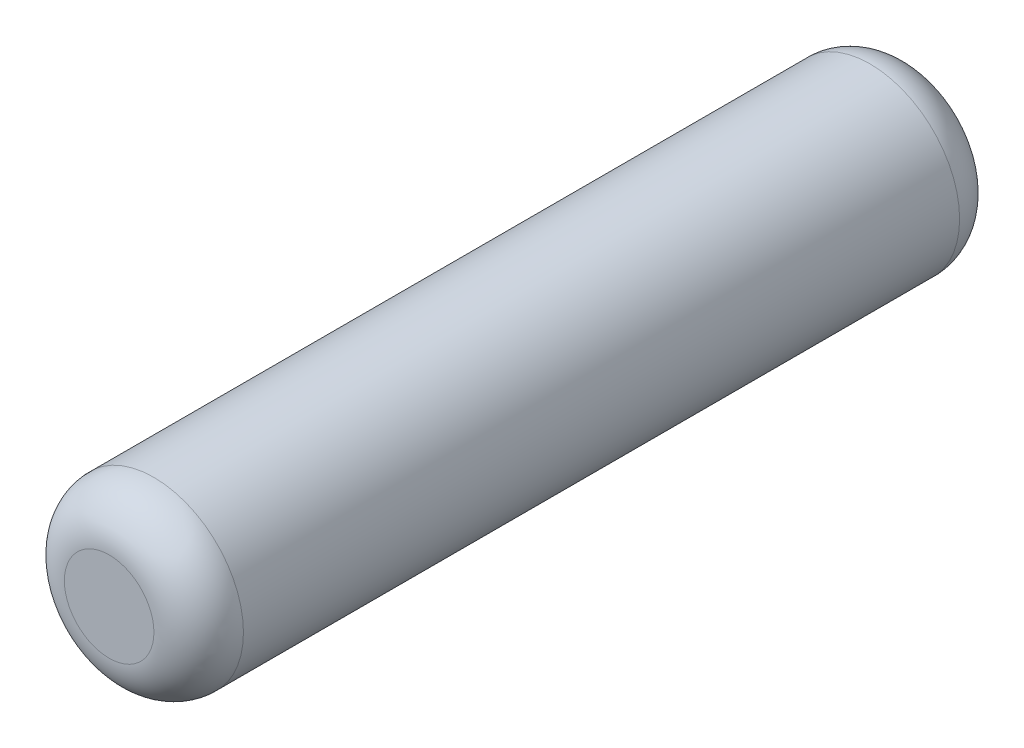
ISO-10303-21;
HEADER;
FILE_DESCRIPTION(('STEP AP214'),'2;1');
FILE_NAME('part.step','',(''),(''),'','','');
FILE_SCHEMA(('AUTOMOTIVE_DESIGN { 1 0 10303 214 1 1 1 1 }'));
ENDSEC;
DATA;
#1=APPLICATION_CONTEXT('core data for automotive mechanical design processes');
#2=APPLICATION_PROTOCOL_DEFINITION('international standard','automotive_design',2000,#1);
#3=PRODUCT_CONTEXT('',#1,'mechanical');
#4=PRODUCT('Part','Part','',(#3));
#5=PRODUCT_RELATED_PRODUCT_CATEGORY('part','',(#4));
#6=PRODUCT_DEFINITION_FORMATION('','',#4);
#7=PRODUCT_DEFINITION_CONTEXT('part definition',#1,'design');
#8=PRODUCT_DEFINITION('design','',#6,#7);
#9=PRODUCT_DEFINITION_SHAPE('','',#8);
#10=(LENGTH_UNIT() NAMED_UNIT(*) SI_UNIT(.MILLI.,.METRE.));
#11=(NAMED_UNIT(*) PLANE_ANGLE_UNIT() SI_UNIT($,.RADIAN.));
#12=(NAMED_UNIT(*) SI_UNIT($,.STERADIAN.) SOLID_ANGLE_UNIT());
#13=UNCERTAINTY_MEASURE_WITH_UNIT(LENGTH_MEASURE(1.E-05),#10,'distance_accuracy_value','');
#14=(GEOMETRIC_REPRESENTATION_CONTEXT(3) GLOBAL_UNCERTAINTY_ASSIGNED_CONTEXT((#13)) GLOBAL_UNIT_ASSIGNED_CONTEXT((#10,
#11,#12)) REPRESENTATION_CONTEXT('',''));
#15=CARTESIAN_POINT('',(0.,0.,0.));
#16=DIRECTION('',(0.,0.,1.));
#17=DIRECTION('',(1.,0.,0.));
#18=AXIS2_PLACEMENT_3D('',#15,#16,#17);
#19=CARTESIAN_POINT('',(0.,0.,-9.));
#20=DIRECTION('',(0.,0.,1.));
#21=DIRECTION('',(1.,0.,0.));
#22=AXIS2_PLACEMENT_3D('',#19,#20,#21);
#23=PLANE('',#22);
#24=CARTESIAN_POINT('',(0.,0.,-9.));
#25=DIRECTION('',(0.,0.,1.));
#26=DIRECTION('',(-1.,0.,0.));
#27=AXIS2_PLACEMENT_3D('',#24,#25,#26);
#28=CIRCLE('',#27,1.);
#29=CARTESIAN_POINT('',(-1.,0.,-9.));
#30=VERTEX_POINT('',#29);
#31=CARTESIAN_POINT('',(1.,0.,-9.));
#32=VERTEX_POINT('',#31);
#33=EDGE_CURVE('E45',#30,#32,#28,.T.);
#34=ORIENTED_EDGE('',*,*,#33,.F.);
#35=CARTESIAN_POINT('',(0.,0.,-9.));
#36=DIRECTION('',(0.,0.,1.));
#37=DIRECTION('',(1.,0.,0.));
#38=AXIS2_PLACEMENT_3D('',#35,#36,#37);
#39=CIRCLE('',#38,1.);
#40=EDGE_CURVE('E42',#32,#30,#39,.T.);
#41=ORIENTED_EDGE('',*,*,#40,.F.);
#42=EDGE_LOOP('',(#34,#41));
#43=FACE_BOUND('',#42,.T.);
#44=ADVANCED_FACE('F16',(#43),#23,.F.);
#45=CARTESIAN_POINT('',(2.,0.,-8.));
#46=CARTESIAN_POINT('',(2.,0.,-8.5857864376269));
#47=CARTESIAN_POINT('',(1.5857864376269,0.,-9.));
#48=CARTESIAN_POINT('',(1.,0.,-9.));
#49=(BOUNDED_CURVE() B_SPLINE_CURVE(3,(#45,#46,#47,#48),.UNSPECIFIED.,.F.,
.F.) B_SPLINE_CURVE_WITH_KNOTS((4,4),(0.,1.),
.UNSPECIFIED.) CURVE() GEOMETRIC_REPRESENTATION_ITEM() RATIONAL_B_SPLINE_CURVE((1.,
0.804737854124365,0.804737854124365,1.)) REPRESENTATION_ITEM(''));
#50=CARTESIAN_POINT('',(0.,0.,-8.));
#51=DIRECTION('',(0.,0.,1.));
#52=AXIS1_PLACEMENT('',#50,#51);
#53=SURFACE_OF_REVOLUTION('',#49,#52);
#54=CARTESIAN_POINT('',(0.,0.,-8.));
#55=DIRECTION('',(0.,0.,-1.));
#56=DIRECTION('',(-1.,0.,0.));
#57=AXIS2_PLACEMENT_3D('',#54,#55,#56);
#58=CIRCLE('',#57,2.);
#59=CARTESIAN_POINT('',(-2.,0.,-8.));
#60=VERTEX_POINT('',#59);
#61=EDGE_CURVE('E52',#60,#60,#58,.F.);
#62=ORIENTED_EDGE('',*,*,#61,.F.);
#63=EDGE_LOOP('',(#62));
#64=FACE_BOUND('',#63,.T.);
#65=ORIENTED_EDGE('',*,*,#40,.T.);
#66=ORIENTED_EDGE('',*,*,#33,.T.);
#67=EDGE_LOOP('',(#65,#66));
#68=FACE_BOUND('',#67,.T.);
#69=ADVANCED_FACE('F51',(#64,#68),#53,.F.);
#70=CARTESIAN_POINT('',(0.,0.,-8.));
#71=DIRECTION('',(0.,0.,-1.));
#72=DIRECTION('',(-1.,0.,0.));
#73=AXIS2_PLACEMENT_3D('',#70,#71,#72);
#74=CYLINDRICAL_SURFACE('',#73,2.);
#75=ORIENTED_EDGE('',*,*,#61,.T.);
#76=EDGE_LOOP('',(#75));
#77=FACE_BOUND('',#76,.T.);
#78=CARTESIAN_POINT('',(0.,0.,7.99999999999999));
#79=DIRECTION('',(0.,0.,1.));
#80=DIRECTION('',(1.,0.,0.));
#81=AXIS2_PLACEMENT_3D('',#78,#79,#80);
#82=CIRCLE('',#81,2.);
#83=CARTESIAN_POINT('',(2.,0.,7.99999999999999));
#84=VERTEX_POINT('',#83);
#85=EDGE_CURVE('E27',#84,#84,#82,.T.);
#86=ORIENTED_EDGE('',*,*,#85,.F.);
#87=EDGE_LOOP('',(#86));
#88=FACE_BOUND('',#87,.T.);
#89=ADVANCED_FACE('F70',(#77,#88),#74,.T.);
#90=CARTESIAN_POINT('',(0.,0.,9.));
#91=DIRECTION('',(0.,0.,1.));
#92=DIRECTION('',(1.,0.,0.));
#93=AXIS2_PLACEMENT_3D('',#90,#91,#92);
#94=PLANE('',#93);
#95=CARTESIAN_POINT('',(0.,0.,9.));
#96=DIRECTION('',(0.,0.,-1.));
#97=DIRECTION('',(-1.,0.,0.));
#98=AXIS2_PLACEMENT_3D('',#95,#96,#97);
#99=CIRCLE('',#98,1.00000000000001);
#100=CARTESIAN_POINT('',(-1.00000000000001,0.,9.));
#101=VERTEX_POINT('',#100);
#102=CARTESIAN_POINT('',(1.00000000000001,0.,9.));
#103=VERTEX_POINT('',#102);
#104=EDGE_CURVE('E11',#101,#103,#99,.T.);
#105=ORIENTED_EDGE('',*,*,#104,.F.);
#106=CARTESIAN_POINT('',(0.,0.,9.));
#107=DIRECTION('',(0.,0.,-1.));
#108=DIRECTION('',(1.,0.,0.));
#109=AXIS2_PLACEMENT_3D('',#106,#107,#108);
#110=CIRCLE('',#109,1.00000000000001);
#111=EDGE_CURVE('E34',#101,#103,#110,.F.);
#112=ORIENTED_EDGE('',*,*,#111,.T.);
#113=EDGE_LOOP('',(#105,#112));
#114=FACE_BOUND('',#113,.T.);
#115=ADVANCED_FACE('F90',(#114),#94,.T.);
#116=CARTESIAN_POINT('',(1.00000000000001,0.,9.));
#117=CARTESIAN_POINT('',(1.58578643762692,0.,8.99999999999999));
#118=CARTESIAN_POINT('',(2.00000000000001,0.,8.58578643762689));
#119=CARTESIAN_POINT('',(2.,0.,7.99999999999999));
#120=(BOUNDED_CURVE() B_SPLINE_CURVE(3,(#116,#117,#118,#119),.UNSPECIFIED.,.F.,
.F.) B_SPLINE_CURVE_WITH_KNOTS((4,4),(0.,1.),
.UNSPECIFIED.) CURVE() GEOMETRIC_REPRESENTATION_ITEM() RATIONAL_B_SPLINE_CURVE((1.,
0.804737854124365,0.804737854124365,1.)) REPRESENTATION_ITEM(''));
#121=CARTESIAN_POINT('',(0.,0.,8.));
#122=DIRECTION('',(0.,0.,1.));
#123=AXIS1_PLACEMENT('',#121,#122);
#124=SURFACE_OF_REVOLUTION('',#120,#123);
#125=ORIENTED_EDGE('',*,*,#85,.T.);
#126=EDGE_LOOP('',(#125));
#127=FACE_BOUND('',#126,.T.);
#128=ORIENTED_EDGE('',*,*,#104,.T.);
#129=ORIENTED_EDGE('',*,*,#111,.F.);
#130=EDGE_LOOP('',(#128,#129));
#131=FACE_BOUND('',#130,.T.);
#132=ADVANCED_FACE('F95',(#127,#131),#124,.F.);
#133=CLOSED_SHELL('',(#44,#69,#89,#115,#132));
#134=MANIFOLD_SOLID_BREP('B1',#133);
#135=ADVANCED_BREP_SHAPE_REPRESENTATION('',(#18,#134),#14);
#136=SHAPE_DEFINITION_REPRESENTATION(#9,#135);
ENDSEC;
END-ISO-10303-21;
